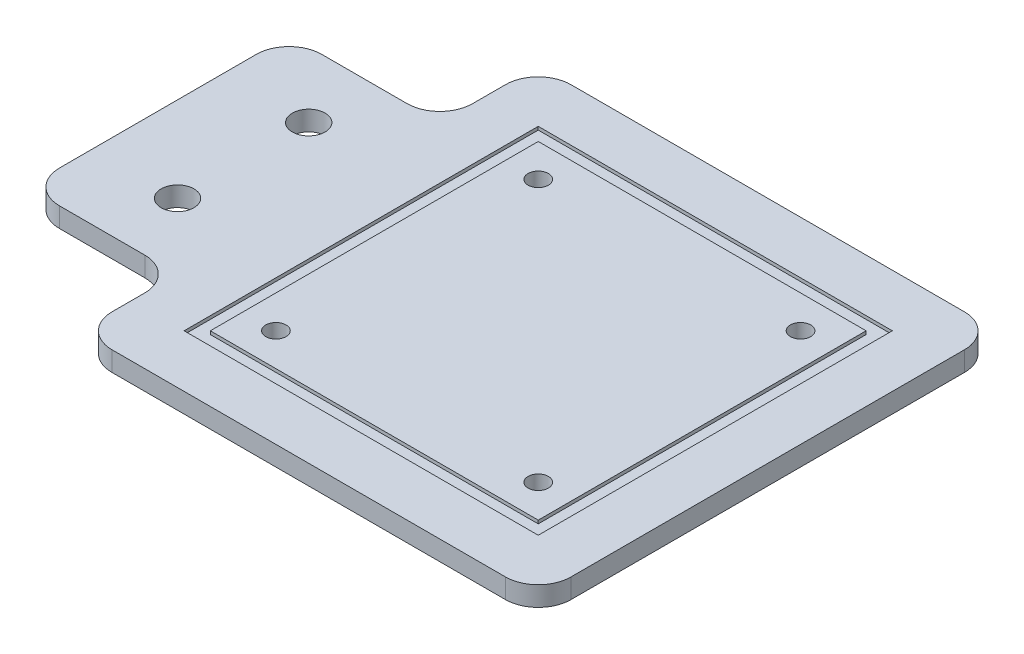
ISO-10303-21;
HEADER;
FILE_DESCRIPTION(('STEP AP214'),'2;1');
FILE_NAME('part.step','',(''),(''),'','','');
FILE_SCHEMA(('AUTOMOTIVE_DESIGN { 1 0 10303 214 1 1 1 1 }'));
ENDSEC;
DATA;
#1=APPLICATION_CONTEXT('core data for automotive mechanical design processes');
#2=APPLICATION_PROTOCOL_DEFINITION('international standard','automotive_design',2000,#1);
#3=PRODUCT_CONTEXT('',#1,'mechanical');
#4=PRODUCT('Part','Part','',(#3));
#5=PRODUCT_RELATED_PRODUCT_CATEGORY('part','',(#4));
#6=PRODUCT_DEFINITION_FORMATION('','',#4);
#7=PRODUCT_DEFINITION_CONTEXT('part definition',#1,'design');
#8=PRODUCT_DEFINITION('design','',#6,#7);
#9=PRODUCT_DEFINITION_SHAPE('','',#8);
#10=(LENGTH_UNIT() NAMED_UNIT(*) SI_UNIT(.MILLI.,.METRE.));
#11=(NAMED_UNIT(*) PLANE_ANGLE_UNIT() SI_UNIT($,.RADIAN.));
#12=(NAMED_UNIT(*) SI_UNIT($,.STERADIAN.) SOLID_ANGLE_UNIT());
#13=UNCERTAINTY_MEASURE_WITH_UNIT(LENGTH_MEASURE(1.E-05),#10,'distance_accuracy_value','');
#14=(GEOMETRIC_REPRESENTATION_CONTEXT(3) GLOBAL_UNCERTAINTY_ASSIGNED_CONTEXT((#13)) GLOBAL_UNIT_ASSIGNED_CONTEXT((#10,
#11,#12)) REPRESENTATION_CONTEXT('',''));
#15=CARTESIAN_POINT('',(0.,0.,0.));
#16=DIRECTION('',(0.,0.,1.));
#17=DIRECTION('',(1.,0.,0.));
#18=AXIS2_PLACEMENT_3D('',#15,#16,#17);
#19=CARTESIAN_POINT('',(23.,20.,40.));
#20=DIRECTION('',(0.,1.,0.));
#21=DIRECTION('',(-1.,0.,0.));
#22=AXIS2_PLACEMENT_3D('',#19,#20,#21);
#23=PLANE('',#22);
#24=CARTESIAN_POINT('',(78.,20.,40.));
#25=DIRECTION('',(0.,1.,0.));
#26=DIRECTION('',(-1.,0.,0.));
#27=AXIS2_PLACEMENT_3D('',#24,#25,#26);
#28=CIRCLE('',#27,1.54999999999999);
#29=CARTESIAN_POINT('',(76.45,20.,40.));
#30=VERTEX_POINT('',#29);
#31=EDGE_CURVE('E503',#30,#30,#28,.F.);
#32=ORIENTED_EDGE('',*,*,#31,.F.);
#33=EDGE_LOOP('',(#32));
#34=FACE_BOUND('',#33,.T.);
#35=CARTESIAN_POINT('',(78.,20.,0.));
#36=DIRECTION('',(0.,1.,0.));
#37=DIRECTION('',(-1.,0.,0.));
#38=AXIS2_PLACEMENT_3D('',#35,#36,#37);
#39=CIRCLE('',#38,1.54999999999999);
#40=CARTESIAN_POINT('',(76.45,20.,0.));
#41=VERTEX_POINT('',#40);
#42=EDGE_CURVE('E520',#41,#41,#39,.F.);
#43=ORIENTED_EDGE('',*,*,#42,.F.);
#44=EDGE_LOOP('',(#43));
#45=FACE_BOUND('',#44,.T.);
#46=CARTESIAN_POINT('',(38.,20.,0.));
#47=DIRECTION('',(0.,1.,0.));
#48=DIRECTION('',(-1.,0.,0.));
#49=AXIS2_PLACEMENT_3D('',#46,#47,#48);
#50=CIRCLE('',#49,1.55);
#51=CARTESIAN_POINT('',(36.45,20.,0.));
#52=VERTEX_POINT('',#51);
#53=EDGE_CURVE('E510',#52,#52,#50,.F.);
#54=ORIENTED_EDGE('',*,*,#53,.F.);
#55=EDGE_LOOP('',(#54));
#56=FACE_BOUND('',#55,.T.);
#57=CARTESIAN_POINT('',(38.,20.,40.));
#58=DIRECTION('',(0.,1.,0.));
#59=DIRECTION('',(-1.,0.,0.));
#60=AXIS2_PLACEMENT_3D('',#57,#58,#59);
#61=CIRCLE('',#60,1.55);
#62=CARTESIAN_POINT('',(36.45,20.,40.));
#63=VERTEX_POINT('',#62);
#64=EDGE_CURVE('E242',#63,#63,#61,.F.);
#65=ORIENTED_EDGE('',*,*,#64,.F.);
#66=EDGE_LOOP('',(#65));
#67=FACE_BOUND('',#66,.T.);
#68=CARTESIAN_POINT('',(13.,20.,10.));
#69=DIRECTION('',(0.,1.,0.));
#70=DIRECTION('',(-1.,0.,0.));
#71=AXIS2_PLACEMENT_3D('',#68,#69,#70);
#72=CIRCLE('',#71,2.5);
#73=CARTESIAN_POINT('',(10.5,20.,10.));
#74=VERTEX_POINT('',#73);
#75=EDGE_CURVE('E347',#74,#74,#72,.F.);
#76=ORIENTED_EDGE('',*,*,#75,.F.);
#77=EDGE_LOOP('',(#76));
#78=FACE_BOUND('',#77,.T.);
#79=CARTESIAN_POINT('',(13.,20.,30.));
#80=DIRECTION('',(0.,1.,0.));
#81=DIRECTION('',(-1.,0.,0.));
#82=AXIS2_PLACEMENT_3D('',#79,#80,#81);
#83=CIRCLE('',#82,2.5);
#84=CARTESIAN_POINT('',(10.5,20.,30.));
#85=VERTEX_POINT('',#84);
#86=EDGE_CURVE('E342',#85,#85,#83,.F.);
#87=ORIENTED_EDGE('',*,*,#86,.F.);
#88=EDGE_LOOP('',(#87));
#89=FACE_BOUND('',#88,.T.);
#90=DIRECTION('',(0.,0.,1.));
#91=VECTOR('',#90,1.);
#92=CARTESIAN_POINT('',(93.,20.,55.));
#93=LINE('',#92,#91);
#94=CARTESIAN_POINT('',(93.,20.,-10.));
#95=VERTEX_POINT('',#94);
#96=CARTESIAN_POINT('',(93.,20.,50.));
#97=VERTEX_POINT('',#96);
#98=EDGE_CURVE('E309',#95,#97,#93,.T.);
#99=ORIENTED_EDGE('',*,*,#98,.T.);
#100=CARTESIAN_POINT('',(88.,20.,50.));
#101=DIRECTION('',(0.,1.,0.));
#102=DIRECTION('',(-1.,0.,0.));
#103=AXIS2_PLACEMENT_3D('',#100,#101,#102);
#104=CIRCLE('',#103,5.);
#105=CARTESIAN_POINT('',(88.,20.,55.));
#106=VERTEX_POINT('',#105);
#107=EDGE_CURVE('E423',#97,#106,#104,.F.);
#108=ORIENTED_EDGE('',*,*,#107,.T.);
#109=DIRECTION('',(-1.,0.,0.));
#110=VECTOR('',#109,1.);
#111=CARTESIAN_POINT('',(93.,20.,55.));
#112=LINE('',#111,#110);
#113=CARTESIAN_POINT('',(28.,20.,55.));
#114=VERTEX_POINT('',#113);
#115=EDGE_CURVE('E323',#106,#114,#112,.T.);
#116=ORIENTED_EDGE('',*,*,#115,.T.);
#117=CARTESIAN_POINT('',(28.,20.,50.));
#118=DIRECTION('',(0.,1.,0.));
#119=DIRECTION('',(-1.,0.,0.));
#120=AXIS2_PLACEMENT_3D('',#117,#118,#119);
#121=CIRCLE('',#120,5.);
#122=CARTESIAN_POINT('',(23.,20.,50.));
#123=VERTEX_POINT('',#122);
#124=EDGE_CURVE('E414',#114,#123,#121,.F.);
#125=ORIENTED_EDGE('',*,*,#124,.T.);
#126=DIRECTION('',(0.,0.,-1.));
#127=VECTOR('',#126,1.);
#128=CARTESIAN_POINT('',(23.,20.,55.));
#129=LINE('',#128,#127);
#130=CARTESIAN_POINT('',(23.,20.,45.));
#131=VERTEX_POINT('',#130);
#132=EDGE_CURVE('E319',#123,#131,#129,.T.);
#133=ORIENTED_EDGE('',*,*,#132,.T.);
#134=CARTESIAN_POINT('',(18.,20.,45.));
#135=DIRECTION('',(0.,1.,0.));
#136=DIRECTION('',(-1.,0.,0.));
#137=AXIS2_PLACEMENT_3D('',#134,#135,#136);
#138=CIRCLE('',#137,5.);
#139=CARTESIAN_POINT('',(18.,20.,40.));
#140=VERTEX_POINT('',#139);
#141=EDGE_CURVE('E11',#131,#140,#138,.T.);
#142=ORIENTED_EDGE('',*,*,#141,.T.);
#143=DIRECTION('',(1.,0.,0.));
#144=VECTOR('',#143,1.);
#145=CARTESIAN_POINT('',(23.,20.,40.));
#146=LINE('',#145,#144);
#147=CARTESIAN_POINT('',(5.,20.,40.));
#148=VERTEX_POINT('',#147);
#149=EDGE_CURVE('E359',#148,#140,#146,.T.);
#150=ORIENTED_EDGE('',*,*,#149,.F.);
#151=CARTESIAN_POINT('',(5.,20.,35.));
#152=DIRECTION('',(0.,1.,0.));
#153=DIRECTION('',(-1.,0.,0.));
#154=AXIS2_PLACEMENT_3D('',#151,#152,#153);
#155=CIRCLE('',#154,5.);
#156=CARTESIAN_POINT('',(0.,20.,35.));
#157=VERTEX_POINT('',#156);
#158=EDGE_CURVE('E66',#148,#157,#155,.F.);
#159=ORIENTED_EDGE('',*,*,#158,.T.);
#160=DIRECTION('',(0.,0.,-1.));
#161=VECTOR('',#160,1.);
#162=CARTESIAN_POINT('',(0.,20.,0.));
#163=LINE('',#162,#161);
#164=CARTESIAN_POINT('',(0.,20.,5.));
#165=VERTEX_POINT('',#164);
#166=EDGE_CURVE('E498',#157,#165,#163,.T.);
#167=ORIENTED_EDGE('',*,*,#166,.T.);
#168=CARTESIAN_POINT('',(5.,20.,5.));
#169=DIRECTION('',(0.,1.,0.));
#170=DIRECTION('',(-1.,0.,0.));
#171=AXIS2_PLACEMENT_3D('',#168,#169,#170);
#172=CIRCLE('',#171,5.);
#173=CARTESIAN_POINT('',(5.,20.,0.));
#174=VERTEX_POINT('',#173);
#175=EDGE_CURVE('E58',#165,#174,#172,.F.);
#176=ORIENTED_EDGE('',*,*,#175,.T.);
#177=DIRECTION('',(1.,0.,0.));
#178=VECTOR('',#177,1.);
#179=CARTESIAN_POINT('',(23.,20.,0.));
#180=LINE('',#179,#178);
#181=CARTESIAN_POINT('',(18.,20.,0.));
#182=VERTEX_POINT('',#181);
#183=EDGE_CURVE('E352',#174,#182,#180,.T.);
#184=ORIENTED_EDGE('',*,*,#183,.T.);
#185=CARTESIAN_POINT('',(18.,20.,-5.));
#186=DIRECTION('',(0.,1.,0.));
#187=DIRECTION('',(-1.,0.,0.));
#188=AXIS2_PLACEMENT_3D('',#185,#186,#187);
#189=CIRCLE('',#188,5.);
#190=CARTESIAN_POINT('',(23.,20.,-5.));
#191=VERTEX_POINT('',#190);
#192=EDGE_CURVE('E470',#182,#191,#189,.T.);
#193=ORIENTED_EDGE('',*,*,#192,.T.);
#194=CARTESIAN_POINT('',(23.,20.,-10.));
#195=VERTEX_POINT('',#194);
#196=EDGE_CURVE('E318',#191,#195,#129,.T.);
#197=ORIENTED_EDGE('',*,*,#196,.T.);
#198=CARTESIAN_POINT('',(28.,20.,-10.));
#199=DIRECTION('',(0.,1.,0.));
#200=DIRECTION('',(-1.,0.,0.));
#201=AXIS2_PLACEMENT_3D('',#198,#199,#200);
#202=CIRCLE('',#201,5.);
#203=CARTESIAN_POINT('',(28.,20.,-15.));
#204=VERTEX_POINT('',#203);
#205=EDGE_CURVE('E417',#195,#204,#202,.F.);
#206=ORIENTED_EDGE('',*,*,#205,.T.);
#207=DIRECTION('',(1.,0.,0.));
#208=VECTOR('',#207,1.);
#209=CARTESIAN_POINT('',(93.,20.,-15.));
#210=LINE('',#209,#208);
#211=CARTESIAN_POINT('',(88.,20.,-15.));
#212=VERTEX_POINT('',#211);
#213=EDGE_CURVE('E313',#204,#212,#210,.T.);
#214=ORIENTED_EDGE('',*,*,#213,.T.);
#215=CARTESIAN_POINT('',(88.,20.,-10.));
#216=DIRECTION('',(0.,1.,0.));
#217=DIRECTION('',(-1.,0.,0.));
#218=AXIS2_PLACEMENT_3D('',#215,#216,#217);
#219=CIRCLE('',#218,5.);
#220=EDGE_CURVE('E420',#212,#95,#219,.F.);
#221=ORIENTED_EDGE('',*,*,#220,.T.);
#222=EDGE_LOOP('',(#99,#108,#116,#125,#133,#142,#150,#159,#167,#176,#184,#193,#197,#206,#214,#221));
#223=FACE_BOUND('',#222,.T.);
#224=ADVANCED_FACE('F42',(#34,#45,#56,#67,#78,#89,#223),#23,.F.);
#225=CARTESIAN_POINT('',(0.,23.,40.));
#226=DIRECTION('',(0.,-1.,0.));
#227=DIRECTION('',(0.,0.,-1.));
#228=AXIS2_PLACEMENT_3D('',#225,#226,#227);
#229=PLANE('',#228);
#230=DIRECTION('',(1.,0.,0.));
#231=VECTOR('',#230,1.);
#232=CARTESIAN_POINT('',(31.,23.,47.));
#233=LINE('',#232,#231);
#234=CARTESIAN_POINT('',(31.,23.,47.));
#235=VERTEX_POINT('',#234);
#236=CARTESIAN_POINT('',(85.,23.,47.));
#237=VERTEX_POINT('',#236);
#238=EDGE_CURVE('E285',#235,#237,#233,.T.);
#239=ORIENTED_EDGE('',*,*,#238,.F.);
#240=DIRECTION('',(0.,0.,1.));
#241=VECTOR('',#240,1.);
#242=CARTESIAN_POINT('',(31.,23.,47.));
#243=LINE('',#242,#241);
#244=CARTESIAN_POINT('',(31.,23.,-6.99999999999999));
#245=VERTEX_POINT('',#244);
#246=EDGE_CURVE('E259',#245,#235,#243,.T.);
#247=ORIENTED_EDGE('',*,*,#246,.F.);
#248=DIRECTION('',(-1.,0.,0.));
#249=VECTOR('',#248,1.);
#250=CARTESIAN_POINT('',(31.,23.,-6.99999999999999));
#251=LINE('',#250,#249);
#252=CARTESIAN_POINT('',(85.,23.,-6.99999999999999));
#253=VERTEX_POINT('',#252);
#254=EDGE_CURVE('E270',#253,#245,#251,.T.);
#255=ORIENTED_EDGE('',*,*,#254,.F.);
#256=DIRECTION('',(0.,0.,-1.));
#257=VECTOR('',#256,1.);
#258=CARTESIAN_POINT('',(85.,23.,47.));
#259=LINE('',#258,#257);
#260=EDGE_CURVE('E289',#237,#253,#259,.T.);
#261=ORIENTED_EDGE('',*,*,#260,.F.);
#262=EDGE_LOOP('',(#239,#247,#255,#261));
#263=FACE_BOUND('',#262,.T.);
#264=CARTESIAN_POINT('',(13.,23.,10.));
#265=DIRECTION('',(0.,1.,0.));
#266=DIRECTION('',(0.,0.,1.));
#267=AXIS2_PLACEMENT_3D('',#264,#265,#266);
#268=CIRCLE('',#267,2.5);
#269=CARTESIAN_POINT('',(13.,23.,12.5));
#270=VERTEX_POINT('',#269);
#271=EDGE_CURVE('E343',#270,#270,#268,.T.);
#272=ORIENTED_EDGE('',*,*,#271,.F.);
#273=EDGE_LOOP('',(#272));
#274=FACE_BOUND('',#273,.T.);
#275=CARTESIAN_POINT('',(13.,23.,30.));
#276=DIRECTION('',(0.,1.,0.));
#277=DIRECTION('',(0.,0.,1.));
#278=AXIS2_PLACEMENT_3D('',#275,#276,#277);
#279=CIRCLE('',#278,2.5);
#280=CARTESIAN_POINT('',(13.,23.,32.5));
#281=VERTEX_POINT('',#280);
#282=EDGE_CURVE('E348',#281,#281,#279,.T.);
#283=ORIENTED_EDGE('',*,*,#282,.F.);
#284=EDGE_LOOP('',(#283));
#285=FACE_BOUND('',#284,.T.);
#286=DIRECTION('',(1.,0.,0.));
#287=VECTOR('',#286,1.);
#288=CARTESIAN_POINT('',(93.,23.,55.));
#289=LINE('',#288,#287);
#290=CARTESIAN_POINT('',(28.,23.,55.));
#291=VERTEX_POINT('',#290);
#292=CARTESIAN_POINT('',(88.,23.,55.));
#293=VERTEX_POINT('',#292);
#294=EDGE_CURVE('E328',#291,#293,#289,.T.);
#295=ORIENTED_EDGE('',*,*,#294,.T.);
#296=CARTESIAN_POINT('',(88.,23.,50.));
#297=DIRECTION('',(0.,-1.,0.));
#298=DIRECTION('',(0.,0.,-1.));
#299=AXIS2_PLACEMENT_3D('',#296,#297,#298);
#300=CIRCLE('',#299,5.);
#301=CARTESIAN_POINT('',(93.,23.,50.));
#302=VERTEX_POINT('',#301);
#303=EDGE_CURVE('E400',#293,#302,#300,.F.);
#304=ORIENTED_EDGE('',*,*,#303,.T.);
#305=DIRECTION('',(0.,0.,-1.));
#306=VECTOR('',#305,1.);
#307=CARTESIAN_POINT('',(93.,23.,55.));
#308=LINE('',#307,#306);
#309=CARTESIAN_POINT('',(93.,23.,-10.));
#310=VERTEX_POINT('',#309);
#311=EDGE_CURVE('E332',#302,#310,#308,.T.);
#312=ORIENTED_EDGE('',*,*,#311,.T.);
#313=CARTESIAN_POINT('',(88.,23.,-10.));
#314=DIRECTION('',(0.,-1.,0.));
#315=DIRECTION('',(0.,0.,-1.));
#316=AXIS2_PLACEMENT_3D('',#313,#314,#315);
#317=CIRCLE('',#316,5.);
#318=CARTESIAN_POINT('',(88.,23.,-15.));
#319=VERTEX_POINT('',#318);
#320=EDGE_CURVE('E397',#310,#319,#317,.F.);
#321=ORIENTED_EDGE('',*,*,#320,.T.);
#322=DIRECTION('',(-1.,0.,0.));
#323=VECTOR('',#322,1.);
#324=CARTESIAN_POINT('',(93.,23.,-15.));
#325=LINE('',#324,#323);
#326=CARTESIAN_POINT('',(28.,23.,-15.));
#327=VERTEX_POINT('',#326);
#328=EDGE_CURVE('E314',#319,#327,#325,.T.);
#329=ORIENTED_EDGE('',*,*,#328,.T.);
#330=CARTESIAN_POINT('',(28.,23.,-10.));
#331=DIRECTION('',(0.,-1.,0.));
#332=DIRECTION('',(0.,0.,-1.));
#333=AXIS2_PLACEMENT_3D('',#330,#331,#332);
#334=CIRCLE('',#333,5.);
#335=CARTESIAN_POINT('',(23.,23.,-10.));
#336=VERTEX_POINT('',#335);
#337=EDGE_CURVE('E394',#327,#336,#334,.F.);
#338=ORIENTED_EDGE('',*,*,#337,.T.);
#339=DIRECTION('',(0.,0.,1.));
#340=VECTOR('',#339,1.);
#341=CARTESIAN_POINT('',(23.,23.,55.));
#342=LINE('',#341,#340);
#343=CARTESIAN_POINT('',(23.,23.,-5.));
#344=VERTEX_POINT('',#343);
#345=EDGE_CURVE('E324',#336,#344,#342,.T.);
#346=ORIENTED_EDGE('',*,*,#345,.T.);
#347=CARTESIAN_POINT('',(18.,23.,-5.));
#348=DIRECTION('',(0.,-1.,0.));
#349=DIRECTION('',(0.,0.,-1.));
#350=AXIS2_PLACEMENT_3D('',#347,#348,#349);
#351=CIRCLE('',#350,5.);
#352=CARTESIAN_POINT('',(18.,23.,0.));
#353=VERTEX_POINT('',#352);
#354=EDGE_CURVE('E467',#344,#353,#351,.T.);
#355=ORIENTED_EDGE('',*,*,#354,.T.);
#356=DIRECTION('',(-1.,0.,0.));
#357=VECTOR('',#356,1.);
#358=CARTESIAN_POINT('',(0.,23.,0.));
#359=LINE('',#358,#357);
#360=CARTESIAN_POINT('',(5.,23.,0.));
#361=VERTEX_POINT('',#360);
#362=EDGE_CURVE('E364',#353,#361,#359,.T.);
#363=ORIENTED_EDGE('',*,*,#362,.T.);
#364=CARTESIAN_POINT('',(5.,23.,5.));
#365=DIRECTION('',(0.,-1.,0.));
#366=DIRECTION('',(0.,0.,-1.));
#367=AXIS2_PLACEMENT_3D('',#364,#365,#366);
#368=CIRCLE('',#367,5.);
#369=CARTESIAN_POINT('',(0.,23.,5.));
#370=VERTEX_POINT('',#369);
#371=EDGE_CURVE('E385',#361,#370,#368,.F.);
#372=ORIENTED_EDGE('',*,*,#371,.T.);
#373=DIRECTION('',(0.,0.,-1.));
#374=VECTOR('',#373,1.);
#375=CARTESIAN_POINT('',(0.,23.,40.));
#376=LINE('',#375,#374);
#377=CARTESIAN_POINT('',(0.,23.,35.));
#378=VERTEX_POINT('',#377);
#379=EDGE_CURVE('E368',#378,#370,#376,.T.);
#380=ORIENTED_EDGE('',*,*,#379,.F.);
#381=CARTESIAN_POINT('',(5.,23.,35.));
#382=DIRECTION('',(0.,-1.,0.));
#383=DIRECTION('',(0.,0.,-1.));
#384=AXIS2_PLACEMENT_3D('',#381,#382,#383);
#385=CIRCLE('',#384,5.);
#386=CARTESIAN_POINT('',(5.,23.,40.));
#387=VERTEX_POINT('',#386);
#388=EDGE_CURVE('E388',#378,#387,#385,.F.);
#389=ORIENTED_EDGE('',*,*,#388,.T.);
#390=DIRECTION('',(-1.,0.,0.));
#391=VECTOR('',#390,1.);
#392=CARTESIAN_POINT('',(0.,23.,40.));
#393=LINE('',#392,#391);
#394=CARTESIAN_POINT('',(18.,23.,40.));
#395=VERTEX_POINT('',#394);
#396=EDGE_CURVE('E363',#395,#387,#393,.T.);
#397=ORIENTED_EDGE('',*,*,#396,.F.);
#398=CARTESIAN_POINT('',(18.,23.,45.));
#399=DIRECTION('',(0.,-1.,0.));
#400=DIRECTION('',(0.,0.,-1.));
#401=AXIS2_PLACEMENT_3D('',#398,#399,#400);
#402=CIRCLE('',#401,5.);
#403=CARTESIAN_POINT('',(23.,23.,45.));
#404=VERTEX_POINT('',#403);
#405=EDGE_CURVE('E51',#395,#404,#402,.T.);
#406=ORIENTED_EDGE('',*,*,#405,.T.);
#407=CARTESIAN_POINT('',(23.,23.,50.));
#408=VERTEX_POINT('',#407);
#409=EDGE_CURVE('E299',#404,#408,#342,.T.);
#410=ORIENTED_EDGE('',*,*,#409,.T.);
#411=CARTESIAN_POINT('',(28.,23.,50.));
#412=DIRECTION('',(0.,-1.,0.));
#413=DIRECTION('',(0.,0.,-1.));
#414=AXIS2_PLACEMENT_3D('',#411,#412,#413);
#415=CIRCLE('',#414,5.);
#416=EDGE_CURVE('E391',#408,#291,#415,.F.);
#417=ORIENTED_EDGE('',*,*,#416,.T.);
#418=EDGE_LOOP('',(#295,#304,#312,#321,#329,#338,#346,#355,#363,#372,#380,#389,#397,#406,#410,#417));
#419=FACE_BOUND('',#418,.T.);
#420=ADVANCED_FACE('F477',(#263,#274,#285,#419),#229,.F.);
#421=CARTESIAN_POINT('',(0.,0.,40.));
#422=DIRECTION('',(1.,0.,0.));
#423=DIRECTION('',(0.,0.,-1.));
#424=AXIS2_PLACEMENT_3D('',#421,#422,#423);
#425=PLANE('',#424);
#426=ORIENTED_EDGE('',*,*,#166,.F.);
#427=DIRECTION('',(0.,-1.,0.));
#428=VECTOR('',#427,1.);
#429=CARTESIAN_POINT('',(0.,0.,35.));
#430=LINE('',#429,#428);
#431=EDGE_CURVE('E464',#157,#378,#430,.F.);
#432=ORIENTED_EDGE('',*,*,#431,.T.);
#433=ORIENTED_EDGE('',*,*,#379,.T.);
#434=DIRECTION('',(0.,-1.,0.));
#435=VECTOR('',#434,1.);
#436=CARTESIAN_POINT('',(0.,20.,5.));
#437=LINE('',#436,#435);
#438=EDGE_CURVE('E461',#370,#165,#437,.T.);
#439=ORIENTED_EDGE('',*,*,#438,.T.);
#440=EDGE_LOOP('',(#426,#432,#433,#439));
#441=FACE_BOUND('',#440,.T.);
#442=ADVANCED_FACE('F497',(#441),#425,.F.);
#443=CARTESIAN_POINT('',(0.,0.,40.));
#444=DIRECTION('',(0.,0.,-1.));
#445=DIRECTION('',(-1.,0.,0.));
#446=AXIS2_PLACEMENT_3D('',#443,#444,#445);
#447=PLANE('',#446);
#448=ORIENTED_EDGE('',*,*,#149,.T.);
#449=DIRECTION('',(0.,1.,0.));
#450=VECTOR('',#449,1.);
#451=CARTESIAN_POINT('',(18.,0.,40.));
#452=LINE('',#451,#450);
#453=EDGE_CURVE('E450',#140,#395,#452,.T.);
#454=ORIENTED_EDGE('',*,*,#453,.T.);
#455=ORIENTED_EDGE('',*,*,#396,.T.);
#456=DIRECTION('',(0.,-1.,0.));
#457=VECTOR('',#456,1.);
#458=CARTESIAN_POINT('',(5.,0.,40.));
#459=LINE('',#458,#457);
#460=EDGE_CURVE('E446',#387,#148,#459,.T.);
#461=ORIENTED_EDGE('',*,*,#460,.T.);
#462=EDGE_LOOP('',(#448,#454,#455,#461));
#463=FACE_BOUND('',#462,.T.);
#464=ADVANCED_FACE('F489',(#463),#447,.F.);
#465=CARTESIAN_POINT('',(0.,0.,0.));
#466=DIRECTION('',(0.,0.,-1.));
#467=DIRECTION('',(-1.,0.,0.));
#468=AXIS2_PLACEMENT_3D('',#465,#466,#467);
#469=PLANE('',#468);
#470=ORIENTED_EDGE('',*,*,#362,.F.);
#471=DIRECTION('',(0.,1.,0.));
#472=VECTOR('',#471,1.);
#473=CARTESIAN_POINT('',(18.,20.,0.));
#474=LINE('',#473,#472);
#475=EDGE_CURVE('E443',#353,#182,#474,.F.);
#476=ORIENTED_EDGE('',*,*,#475,.T.);
#477=ORIENTED_EDGE('',*,*,#183,.F.);
#478=DIRECTION('',(0.,-1.,0.));
#479=VECTOR('',#478,1.);
#480=CARTESIAN_POINT('',(5.,23.,0.));
#481=LINE('',#480,#479);
#482=EDGE_CURVE('E440',#174,#361,#481,.F.);
#483=ORIENTED_EDGE('',*,*,#482,.T.);
#484=EDGE_LOOP('',(#470,#476,#477,#483));
#485=FACE_BOUND('',#484,.T.);
#486=ADVANCED_FACE('F550',(#485),#469,.T.);
#487=CARTESIAN_POINT('',(13.,-0.001000000000001,30.));
#488=DIRECTION('',(0.,1.,0.));
#489=DIRECTION('',(0.,0.,1.));
#490=AXIS2_PLACEMENT_3D('',#487,#488,#489);
#491=CYLINDRICAL_SURFACE('',#490,2.5);
#492=ORIENTED_EDGE('',*,*,#282,.T.);
#493=EDGE_LOOP('',(#492));
#494=FACE_BOUND('',#493,.T.);
#495=ORIENTED_EDGE('',*,*,#86,.T.);
#496=EDGE_LOOP('',(#495));
#497=FACE_BOUND('',#496,.T.);
#498=ADVANCED_FACE('F547',(#494,#497),#491,.F.);
#499=CARTESIAN_POINT('',(13.,-0.001000000000001,10.));
#500=DIRECTION('',(0.,1.,0.));
#501=DIRECTION('',(0.,0.,1.));
#502=AXIS2_PLACEMENT_3D('',#499,#500,#501);
#503=CYLINDRICAL_SURFACE('',#502,2.5);
#504=ORIENTED_EDGE('',*,*,#271,.T.);
#505=EDGE_LOOP('',(#504));
#506=FACE_BOUND('',#505,.T.);
#507=ORIENTED_EDGE('',*,*,#75,.T.);
#508=EDGE_LOOP('',(#507));
#509=FACE_BOUND('',#508,.T.);
#510=ADVANCED_FACE('F549',(#506,#509),#503,.F.);
#511=CARTESIAN_POINT('',(23.,-78.9949493661166,55.));
#512=DIRECTION('',(-1.,0.,0.));
#513=DIRECTION('',(0.,0.,1.));
#514=AXIS2_PLACEMENT_3D('',#511,#512,#513);
#515=PLANE('',#514);
#516=ORIENTED_EDGE('',*,*,#409,.F.);
#517=DIRECTION('',(0.,1.,0.));
#518=VECTOR('',#517,1.);
#519=CARTESIAN_POINT('',(23.,-78.9949493661166,45.));
#520=LINE('',#519,#518);
#521=EDGE_CURVE('E458',#404,#131,#520,.F.);
#522=ORIENTED_EDGE('',*,*,#521,.T.);
#523=ORIENTED_EDGE('',*,*,#132,.F.);
#524=DIRECTION('',(0.,1.,0.));
#525=VECTOR('',#524,1.);
#526=CARTESIAN_POINT('',(23.,-78.9949493661166,50.));
#527=LINE('',#526,#525);
#528=EDGE_CURVE('E454',#123,#408,#527,.T.);
#529=ORIENTED_EDGE('',*,*,#528,.T.);
#530=EDGE_LOOP('',(#516,#522,#523,#529));
#531=FACE_BOUND('',#530,.T.);
#532=ADVANCED_FACE('F482',(#531),#515,.T.);
#533=ORIENTED_EDGE('',*,*,#345,.F.);
#534=DIRECTION('',(0.,1.,0.));
#535=VECTOR('',#534,1.);
#536=CARTESIAN_POINT('',(23.,-78.9949493661166,-10.));
#537=LINE('',#536,#535);
#538=EDGE_CURVE('E437',#336,#195,#537,.F.);
#539=ORIENTED_EDGE('',*,*,#538,.T.);
#540=ORIENTED_EDGE('',*,*,#196,.F.);
#541=DIRECTION('',(0.,1.,0.));
#542=VECTOR('',#541,1.);
#543=CARTESIAN_POINT('',(23.,23.,-5.));
#544=LINE('',#543,#542);
#545=EDGE_CURVE('E433',#191,#344,#544,.T.);
#546=ORIENTED_EDGE('',*,*,#545,.T.);
#547=EDGE_LOOP('',(#533,#539,#540,#546));
#548=FACE_BOUND('',#547,.T.);
#549=ADVANCED_FACE('F684',(#548),#515,.T.);
#550=CARTESIAN_POINT('',(93.,-78.9949493661166,-15.));
#551=DIRECTION('',(0.,0.,-1.));
#552=DIRECTION('',(-1.,0.,0.));
#553=AXIS2_PLACEMENT_3D('',#550,#551,#552);
#554=PLANE('',#553);
#555=ORIENTED_EDGE('',*,*,#328,.F.);
#556=DIRECTION('',(0.,1.,0.));
#557=VECTOR('',#556,1.);
#558=CARTESIAN_POINT('',(88.,-78.9949493661166,-15.));
#559=LINE('',#558,#557);
#560=EDGE_CURVE('E430',#319,#212,#559,.F.);
#561=ORIENTED_EDGE('',*,*,#560,.T.);
#562=ORIENTED_EDGE('',*,*,#213,.F.);
#563=DIRECTION('',(0.,1.,0.));
#564=VECTOR('',#563,1.);
#565=CARTESIAN_POINT('',(28.,-78.9949493661166,-15.));
#566=LINE('',#565,#564);
#567=EDGE_CURVE('E426',#204,#327,#566,.T.);
#568=ORIENTED_EDGE('',*,*,#567,.T.);
#569=EDGE_LOOP('',(#555,#561,#562,#568));
#570=FACE_BOUND('',#569,.T.);
#571=ADVANCED_FACE('F673',(#570),#554,.T.);
#572=CARTESIAN_POINT('',(93.,-78.9949493661166,55.));
#573=DIRECTION('',(1.,0.,0.));
#574=DIRECTION('',(0.,0.,-1.));
#575=AXIS2_PLACEMENT_3D('',#572,#573,#574);
#576=PLANE('',#575);
#577=ORIENTED_EDGE('',*,*,#311,.F.);
#578=DIRECTION('',(0.,1.,0.));
#579=VECTOR('',#578,1.);
#580=CARTESIAN_POINT('',(93.,-78.9949493661166,50.));
#581=LINE('',#580,#579);
#582=EDGE_CURVE('E407',#302,#97,#581,.F.);
#583=ORIENTED_EDGE('',*,*,#582,.T.);
#584=ORIENTED_EDGE('',*,*,#98,.F.);
#585=DIRECTION('',(0.,1.,0.));
#586=VECTOR('',#585,1.);
#587=CARTESIAN_POINT('',(93.,-78.9949493661166,-10.));
#588=LINE('',#587,#586);
#589=EDGE_CURVE('E403',#95,#310,#588,.T.);
#590=ORIENTED_EDGE('',*,*,#589,.T.);
#591=EDGE_LOOP('',(#577,#583,#584,#590));
#592=FACE_BOUND('',#591,.T.);
#593=ADVANCED_FACE('F660',(#592),#576,.T.);
#594=CARTESIAN_POINT('',(93.,-78.9949493661166,55.));
#595=DIRECTION('',(0.,0.,1.));
#596=DIRECTION('',(1.,0.,0.));
#597=AXIS2_PLACEMENT_3D('',#594,#595,#596);
#598=PLANE('',#597);
#599=ORIENTED_EDGE('',*,*,#115,.F.);
#600=DIRECTION('',(0.,1.,0.));
#601=VECTOR('',#600,1.);
#602=CARTESIAN_POINT('',(88.,-78.9949493661166,55.));
#603=LINE('',#602,#601);
#604=EDGE_CURVE('E381',#106,#293,#603,.T.);
#605=ORIENTED_EDGE('',*,*,#604,.T.);
#606=ORIENTED_EDGE('',*,*,#294,.F.);
#607=DIRECTION('',(0.,1.,0.));
#608=VECTOR('',#607,1.);
#609=CARTESIAN_POINT('',(28.,-78.9949493661166,55.));
#610=LINE('',#609,#608);
#611=EDGE_CURVE('E378',#291,#114,#610,.F.);
#612=ORIENTED_EDGE('',*,*,#611,.T.);
#613=EDGE_LOOP('',(#599,#605,#606,#612));
#614=FACE_BOUND('',#613,.T.);
#615=ADVANCED_FACE('F654',(#614),#598,.T.);
#616=CARTESIAN_POINT('',(31.,22.5,47.));
#617=DIRECTION('',(-1.,0.,0.));
#618=DIRECTION('',(0.,0.,1.));
#619=AXIS2_PLACEMENT_3D('',#616,#617,#618);
#620=PLANE('',#619);
#621=ORIENTED_EDGE('',*,*,#246,.T.);
#622=DIRECTION('',(0.,1.,0.));
#623=VECTOR('',#622,1.);
#624=CARTESIAN_POINT('',(31.,22.5,47.));
#625=LINE('',#624,#623);
#626=CARTESIAN_POINT('',(31.,22.5,47.));
#627=VERTEX_POINT('',#626);
#628=EDGE_CURVE('E282',#627,#235,#625,.T.);
#629=ORIENTED_EDGE('',*,*,#628,.F.);
#630=DIRECTION('',(0.,0.,1.));
#631=VECTOR('',#630,1.);
#632=CARTESIAN_POINT('',(31.,22.5,47.));
#633=LINE('',#632,#631);
#634=CARTESIAN_POINT('',(31.,22.5,-6.99999999999999));
#635=VERTEX_POINT('',#634);
#636=EDGE_CURVE('E265',#635,#627,#633,.T.);
#637=ORIENTED_EDGE('',*,*,#636,.F.);
#638=DIRECTION('',(0.,1.,0.));
#639=VECTOR('',#638,1.);
#640=CARTESIAN_POINT('',(31.,22.5,-6.99999999999999));
#641=LINE('',#640,#639);
#642=EDGE_CURVE('E296',#635,#245,#641,.T.);
#643=ORIENTED_EDGE('',*,*,#642,.T.);
#644=EDGE_LOOP('',(#621,#629,#637,#643));
#645=FACE_BOUND('',#644,.T.);
#646=ADVANCED_FACE('F659',(#645),#620,.F.);
#647=CARTESIAN_POINT('',(31.,22.5,-6.99999999999999));
#648=DIRECTION('',(0.,0.,-1.));
#649=DIRECTION('',(-1.,0.,0.));
#650=AXIS2_PLACEMENT_3D('',#647,#648,#649);
#651=PLANE('',#650);
#652=ORIENTED_EDGE('',*,*,#254,.T.);
#653=ORIENTED_EDGE('',*,*,#642,.F.);
#654=DIRECTION('',(-1.,0.,0.));
#655=VECTOR('',#654,1.);
#656=CARTESIAN_POINT('',(31.,22.5,-6.99999999999999));
#657=LINE('',#656,#655);
#658=CARTESIAN_POINT('',(85.,22.5,-6.99999999999999));
#659=VERTEX_POINT('',#658);
#660=EDGE_CURVE('E278',#659,#635,#657,.T.);
#661=ORIENTED_EDGE('',*,*,#660,.F.);
#662=DIRECTION('',(0.,1.,0.));
#663=VECTOR('',#662,1.);
#664=CARTESIAN_POINT('',(85.,22.5,-6.99999999999999));
#665=LINE('',#664,#663);
#666=EDGE_CURVE('E300',#659,#253,#665,.T.);
#667=ORIENTED_EDGE('',*,*,#666,.T.);
#668=EDGE_LOOP('',(#652,#653,#661,#667));
#669=FACE_BOUND('',#668,.T.);
#670=ADVANCED_FACE('F857',(#669),#651,.F.);
#671=CARTESIAN_POINT('',(85.,22.5,47.));
#672=DIRECTION('',(1.,0.,0.));
#673=DIRECTION('',(0.,0.,-1.));
#674=AXIS2_PLACEMENT_3D('',#671,#672,#673);
#675=PLANE('',#674);
#676=ORIENTED_EDGE('',*,*,#260,.T.);
#677=ORIENTED_EDGE('',*,*,#666,.F.);
#678=DIRECTION('',(0.,0.,-1.));
#679=VECTOR('',#678,1.);
#680=CARTESIAN_POINT('',(85.,22.5,47.));
#681=LINE('',#680,#679);
#682=CARTESIAN_POINT('',(85.,22.5,47.));
#683=VERTEX_POINT('',#682);
#684=EDGE_CURVE('E274',#683,#659,#681,.T.);
#685=ORIENTED_EDGE('',*,*,#684,.F.);
#686=DIRECTION('',(0.,1.,0.));
#687=VECTOR('',#686,1.);
#688=CARTESIAN_POINT('',(85.,22.5,47.));
#689=LINE('',#688,#687);
#690=EDGE_CURVE('E303',#683,#237,#689,.T.);
#691=ORIENTED_EDGE('',*,*,#690,.T.);
#692=EDGE_LOOP('',(#676,#677,#685,#691));
#693=FACE_BOUND('',#692,.T.);
#694=ADVANCED_FACE('F846',(#693),#675,.F.);
#695=CARTESIAN_POINT('',(31.,22.5,47.));
#696=DIRECTION('',(0.,0.,1.));
#697=DIRECTION('',(1.,0.,0.));
#698=AXIS2_PLACEMENT_3D('',#695,#696,#697);
#699=PLANE('',#698);
#700=ORIENTED_EDGE('',*,*,#238,.T.);
#701=ORIENTED_EDGE('',*,*,#690,.F.);
#702=DIRECTION('',(1.,0.,0.));
#703=VECTOR('',#702,1.);
#704=CARTESIAN_POINT('',(31.,22.5,47.));
#705=LINE('',#704,#703);
#706=EDGE_CURVE('E269',#627,#683,#705,.T.);
#707=ORIENTED_EDGE('',*,*,#706,.F.);
#708=ORIENTED_EDGE('',*,*,#628,.T.);
#709=EDGE_LOOP('',(#700,#701,#707,#708));
#710=FACE_BOUND('',#709,.T.);
#711=ADVANCED_FACE('F836',(#710),#699,.F.);
#712=CARTESIAN_POINT('',(0.,22.5,0.));
#713=DIRECTION('',(0.,-1.,0.));
#714=DIRECTION('',(0.,0.,-1.));
#715=AXIS2_PLACEMENT_3D('',#712,#713,#714);
#716=PLANE('',#715);
#717=DIRECTION('',(0.,0.,-1.));
#718=VECTOR('',#717,1.);
#719=CARTESIAN_POINT('',(83.,22.5,45.));
#720=LINE('',#719,#718);
#721=CARTESIAN_POINT('',(83.,22.5,45.));
#722=VERTEX_POINT('',#721);
#723=CARTESIAN_POINT('',(83.,22.5,-4.99999999999999));
#724=VERTEX_POINT('',#723);
#725=EDGE_CURVE('E225',#722,#724,#720,.T.);
#726=ORIENTED_EDGE('',*,*,#725,.F.);
#727=DIRECTION('',(1.,0.,0.));
#728=VECTOR('',#727,1.);
#729=CARTESIAN_POINT('',(33.,22.5,45.));
#730=LINE('',#729,#728);
#731=CARTESIAN_POINT('',(33.,22.5,45.));
#732=VERTEX_POINT('',#731);
#733=EDGE_CURVE('E218',#732,#722,#730,.T.);
#734=ORIENTED_EDGE('',*,*,#733,.F.);
#735=DIRECTION('',(0.,0.,1.));
#736=VECTOR('',#735,1.);
#737=CARTESIAN_POINT('',(33.,22.5,45.));
#738=LINE('',#737,#736);
#739=CARTESIAN_POINT('',(33.,22.5,-4.99999999999999));
#740=VERTEX_POINT('',#739);
#741=EDGE_CURVE('E228',#740,#732,#738,.T.);
#742=ORIENTED_EDGE('',*,*,#741,.F.);
#743=DIRECTION('',(-1.,0.,0.));
#744=VECTOR('',#743,1.);
#745=CARTESIAN_POINT('',(33.,22.5,-4.99999999999999));
#746=LINE('',#745,#744);
#747=EDGE_CURVE('E209',#724,#740,#746,.T.);
#748=ORIENTED_EDGE('',*,*,#747,.F.);
#749=EDGE_LOOP('',(#726,#734,#742,#748));
#750=FACE_BOUND('',#749,.T.);
#751=ORIENTED_EDGE('',*,*,#636,.T.);
#752=ORIENTED_EDGE('',*,*,#706,.T.);
#753=ORIENTED_EDGE('',*,*,#684,.T.);
#754=ORIENTED_EDGE('',*,*,#660,.T.);
#755=EDGE_LOOP('',(#751,#752,#753,#754));
#756=FACE_BOUND('',#755,.T.);
#757=ADVANCED_FACE('F222',(#750,#756),#716,.F.);
#758=CARTESIAN_POINT('',(83.,22.5,45.));
#759=DIRECTION('',(1.,0.,0.));
#760=DIRECTION('',(0.,0.,-1.));
#761=AXIS2_PLACEMENT_3D('',#758,#759,#760);
#762=PLANE('',#761);
#763=DIRECTION('',(0.,0.,-1.));
#764=VECTOR('',#763,1.);
#765=CARTESIAN_POINT('',(83.,23.,45.));
#766=LINE('',#765,#764);
#767=CARTESIAN_POINT('',(83.,23.,45.));
#768=VERTEX_POINT('',#767);
#769=CARTESIAN_POINT('',(83.,23.,-4.99999999999999));
#770=VERTEX_POINT('',#769);
#771=EDGE_CURVE('E249',#768,#770,#766,.T.);
#772=ORIENTED_EDGE('',*,*,#771,.F.);
#773=DIRECTION('',(0.,1.,0.));
#774=VECTOR('',#773,1.);
#775=CARTESIAN_POINT('',(83.,22.5,45.));
#776=LINE('',#775,#774);
#777=EDGE_CURVE('E233',#722,#768,#776,.T.);
#778=ORIENTED_EDGE('',*,*,#777,.F.);
#779=ORIENTED_EDGE('',*,*,#725,.T.);
#780=DIRECTION('',(0.,1.,0.));
#781=VECTOR('',#780,1.);
#782=CARTESIAN_POINT('',(83.,22.5,-4.99999999999999));
#783=LINE('',#782,#781);
#784=EDGE_CURVE('E205',#724,#770,#783,.T.);
#785=ORIENTED_EDGE('',*,*,#784,.T.);
#786=EDGE_LOOP('',(#772,#778,#779,#785));
#787=FACE_BOUND('',#786,.T.);
#788=ADVANCED_FACE('F232',(#787),#762,.T.);
#789=CARTESIAN_POINT('',(33.,22.5,45.));
#790=DIRECTION('',(0.,0.,1.));
#791=DIRECTION('',(1.,0.,0.));
#792=AXIS2_PLACEMENT_3D('',#789,#790,#791);
#793=PLANE('',#792);
#794=DIRECTION('',(1.,0.,0.));
#795=VECTOR('',#794,1.);
#796=CARTESIAN_POINT('',(33.,23.,45.));
#797=LINE('',#796,#795);
#798=CARTESIAN_POINT('',(33.,23.,45.));
#799=VERTEX_POINT('',#798);
#800=EDGE_CURVE('E235',#799,#768,#797,.T.);
#801=ORIENTED_EDGE('',*,*,#800,.F.);
#802=DIRECTION('',(0.,1.,0.));
#803=VECTOR('',#802,1.);
#804=CARTESIAN_POINT('',(33.,22.5,45.));
#805=LINE('',#804,#803);
#806=EDGE_CURVE('E260',#732,#799,#805,.T.);
#807=ORIENTED_EDGE('',*,*,#806,.F.);
#808=ORIENTED_EDGE('',*,*,#733,.T.);
#809=ORIENTED_EDGE('',*,*,#777,.T.);
#810=EDGE_LOOP('',(#801,#807,#808,#809));
#811=FACE_BOUND('',#810,.T.);
#812=ADVANCED_FACE('F806',(#811),#793,.T.);
#813=CARTESIAN_POINT('',(33.,22.5,45.));
#814=DIRECTION('',(-1.,0.,0.));
#815=DIRECTION('',(0.,0.,1.));
#816=AXIS2_PLACEMENT_3D('',#813,#814,#815);
#817=PLANE('',#816);
#818=DIRECTION('',(0.,0.,1.));
#819=VECTOR('',#818,1.);
#820=CARTESIAN_POINT('',(33.,23.,45.));
#821=LINE('',#820,#819);
#822=CARTESIAN_POINT('',(33.,23.,-4.99999999999998));
#823=VERTEX_POINT('',#822);
#824=EDGE_CURVE('E239',#823,#799,#821,.T.);
#825=ORIENTED_EDGE('',*,*,#824,.F.);
#826=DIRECTION('',(0.,1.,0.));
#827=VECTOR('',#826,1.);
#828=CARTESIAN_POINT('',(33.,22.5,-4.99999999999999));
#829=LINE('',#828,#827);
#830=EDGE_CURVE('E217',#740,#823,#829,.T.);
#831=ORIENTED_EDGE('',*,*,#830,.F.);
#832=ORIENTED_EDGE('',*,*,#741,.T.);
#833=ORIENTED_EDGE('',*,*,#806,.T.);
#834=EDGE_LOOP('',(#825,#831,#832,#833));
#835=FACE_BOUND('',#834,.T.);
#836=ADVANCED_FACE('F796',(#835),#817,.T.);
#837=CARTESIAN_POINT('',(33.,22.5,-4.99999999999999));
#838=DIRECTION('',(0.,0.,-1.));
#839=DIRECTION('',(-1.,0.,0.));
#840=AXIS2_PLACEMENT_3D('',#837,#838,#839);
#841=PLANE('',#840);
#842=DIRECTION('',(-1.,0.,0.));
#843=VECTOR('',#842,1.);
#844=CARTESIAN_POINT('',(33.,23.,-4.99999999999999));
#845=LINE('',#844,#843);
#846=EDGE_CURVE('E211',#770,#823,#845,.T.);
#847=ORIENTED_EDGE('',*,*,#846,.F.);
#848=ORIENTED_EDGE('',*,*,#784,.F.);
#849=ORIENTED_EDGE('',*,*,#747,.T.);
#850=ORIENTED_EDGE('',*,*,#830,.T.);
#851=EDGE_LOOP('',(#847,#848,#849,#850));
#852=FACE_BOUND('',#851,.T.);
#853=ADVANCED_FACE('F207',(#852),#841,.T.);
#854=CARTESIAN_POINT('',(78.,23.,40.));
#855=DIRECTION('',(0.,1.,0.));
#856=DIRECTION('',(0.,0.,1.));
#857=AXIS2_PLACEMENT_3D('',#854,#855,#856);
#858=CIRCLE('',#857,1.54999999999999);
#859=CARTESIAN_POINT('',(78.,23.,41.55));
#860=VERTEX_POINT('',#859);
#861=EDGE_CURVE('E507',#860,#860,#858,.T.);
#862=ORIENTED_EDGE('',*,*,#861,.F.);
#863=EDGE_LOOP('',(#862));
#864=FACE_BOUND('',#863,.T.);
#865=CARTESIAN_POINT('',(78.,23.,0.));
#866=DIRECTION('',(0.,1.,0.));
#867=DIRECTION('',(0.,0.,1.));
#868=AXIS2_PLACEMENT_3D('',#865,#866,#867);
#869=CIRCLE('',#868,1.54999999999999);
#870=CARTESIAN_POINT('',(78.,23.,1.55000000000001));
#871=VERTEX_POINT('',#870);
#872=EDGE_CURVE('E515',#871,#871,#869,.T.);
#873=ORIENTED_EDGE('',*,*,#872,.F.);
#874=EDGE_LOOP('',(#873));
#875=FACE_BOUND('',#874,.T.);
#876=CARTESIAN_POINT('',(38.,23.,0.));
#877=DIRECTION('',(0.,1.,0.));
#878=DIRECTION('',(0.,0.,1.));
#879=AXIS2_PLACEMENT_3D('',#876,#877,#878);
#880=CIRCLE('',#879,1.55);
#881=CARTESIAN_POINT('',(38.,23.,1.55000000000002));
#882=VERTEX_POINT('',#881);
#883=EDGE_CURVE('E514',#882,#882,#880,.T.);
#884=ORIENTED_EDGE('',*,*,#883,.F.);
#885=EDGE_LOOP('',(#884));
#886=FACE_BOUND('',#885,.T.);
#887=CARTESIAN_POINT('',(38.,23.,40.));
#888=DIRECTION('',(0.,1.,0.));
#889=DIRECTION('',(0.,0.,1.));
#890=AXIS2_PLACEMENT_3D('',#887,#888,#889);
#891=CIRCLE('',#890,1.55);
#892=CARTESIAN_POINT('',(38.,23.,41.55));
#893=VERTEX_POINT('',#892);
#894=EDGE_CURVE('E519',#893,#893,#891,.T.);
#895=ORIENTED_EDGE('',*,*,#894,.F.);
#896=EDGE_LOOP('',(#895));
#897=FACE_BOUND('',#896,.T.);
#898=ORIENTED_EDGE('',*,*,#771,.T.);
#899=ORIENTED_EDGE('',*,*,#846,.T.);
#900=ORIENTED_EDGE('',*,*,#824,.T.);
#901=ORIENTED_EDGE('',*,*,#800,.T.);
#902=EDGE_LOOP('',(#898,#899,#900,#901));
#903=FACE_BOUND('',#902,.T.);
#904=ADVANCED_FACE('F569',(#864,#875,#886,#897,#903),#229,.F.);
#905=CARTESIAN_POINT('',(38.,-0.001000000000001,40.));
#906=DIRECTION('',(0.,1.,0.));
#907=DIRECTION('',(0.,0.,1.));
#908=AXIS2_PLACEMENT_3D('',#905,#906,#907);
#909=CYLINDRICAL_SURFACE('',#908,1.55);
#910=ORIENTED_EDGE('',*,*,#894,.T.);
#911=EDGE_LOOP('',(#910));
#912=FACE_BOUND('',#911,.T.);
#913=ORIENTED_EDGE('',*,*,#64,.T.);
#914=EDGE_LOOP('',(#913));
#915=FACE_BOUND('',#914,.T.);
#916=ADVANCED_FACE('F537',(#912,#915),#909,.F.);
#917=CARTESIAN_POINT('',(38.,-0.001000000000001,0.));
#918=DIRECTION('',(0.,1.,0.));
#919=DIRECTION('',(0.,0.,1.));
#920=AXIS2_PLACEMENT_3D('',#917,#918,#919);
#921=CYLINDRICAL_SURFACE('',#920,1.55);
#922=ORIENTED_EDGE('',*,*,#883,.T.);
#923=EDGE_LOOP('',(#922));
#924=FACE_BOUND('',#923,.T.);
#925=ORIENTED_EDGE('',*,*,#53,.T.);
#926=EDGE_LOOP('',(#925));
#927=FACE_BOUND('',#926,.T.);
#928=ADVANCED_FACE('F757',(#924,#927),#921,.F.);
#929=CARTESIAN_POINT('',(78.,-0.001000000000001,0.));
#930=DIRECTION('',(0.,1.,0.));
#931=DIRECTION('',(0.,0.,1.));
#932=AXIS2_PLACEMENT_3D('',#929,#930,#931);
#933=CYLINDRICAL_SURFACE('',#932,1.54999999999999);
#934=ORIENTED_EDGE('',*,*,#872,.T.);
#935=EDGE_LOOP('',(#934));
#936=FACE_BOUND('',#935,.T.);
#937=ORIENTED_EDGE('',*,*,#42,.T.);
#938=EDGE_LOOP('',(#937));
#939=FACE_BOUND('',#938,.T.);
#940=ADVANCED_FACE('F746',(#936,#939),#933,.F.);
#941=CARTESIAN_POINT('',(78.,-0.001000000000001,40.));
#942=DIRECTION('',(0.,1.,0.));
#943=DIRECTION('',(0.,0.,1.));
#944=AXIS2_PLACEMENT_3D('',#941,#942,#943);
#945=CYLINDRICAL_SURFACE('',#944,1.54999999999999);
#946=ORIENTED_EDGE('',*,*,#861,.T.);
#947=EDGE_LOOP('',(#946));
#948=FACE_BOUND('',#947,.T.);
#949=ORIENTED_EDGE('',*,*,#31,.T.);
#950=EDGE_LOOP('',(#949));
#951=FACE_BOUND('',#950,.T.);
#952=ADVANCED_FACE('F575',(#948,#951),#945,.F.);
#953=CARTESIAN_POINT('',(88.,-78.9949493661166,50.));
#954=DIRECTION('',(0.,1.,0.));
#955=DIRECTION('',(0.,0.,1.));
#956=AXIS2_PLACEMENT_3D('',#953,#954,#955);
#957=CYLINDRICAL_SURFACE('',#956,5.);
#958=ORIENTED_EDGE('',*,*,#107,.F.);
#959=ORIENTED_EDGE('',*,*,#582,.F.);
#960=ORIENTED_EDGE('',*,*,#303,.F.);
#961=ORIENTED_EDGE('',*,*,#604,.F.);
#962=EDGE_LOOP('',(#958,#959,#960,#961));
#963=FACE_BOUND('',#962,.T.);
#964=ADVANCED_FACE('F571',(#963),#957,.T.);
#965=CARTESIAN_POINT('',(88.,-78.9949493661166,-10.));
#966=DIRECTION('',(0.,1.,0.));
#967=DIRECTION('',(0.,0.,1.));
#968=AXIS2_PLACEMENT_3D('',#965,#966,#967);
#969=CYLINDRICAL_SURFACE('',#968,5.);
#970=ORIENTED_EDGE('',*,*,#220,.F.);
#971=ORIENTED_EDGE('',*,*,#560,.F.);
#972=ORIENTED_EDGE('',*,*,#320,.F.);
#973=ORIENTED_EDGE('',*,*,#589,.F.);
#974=EDGE_LOOP('',(#970,#971,#972,#973));
#975=FACE_BOUND('',#974,.T.);
#976=ADVANCED_FACE('F574',(#975),#969,.T.);
#977=CARTESIAN_POINT('',(28.,-78.9949493661166,-10.));
#978=DIRECTION('',(0.,1.,0.));
#979=DIRECTION('',(0.,0.,1.));
#980=AXIS2_PLACEMENT_3D('',#977,#978,#979);
#981=CYLINDRICAL_SURFACE('',#980,5.);
#982=ORIENTED_EDGE('',*,*,#205,.F.);
#983=ORIENTED_EDGE('',*,*,#538,.F.);
#984=ORIENTED_EDGE('',*,*,#337,.F.);
#985=ORIENTED_EDGE('',*,*,#567,.F.);
#986=EDGE_LOOP('',(#982,#983,#984,#985));
#987=FACE_BOUND('',#986,.T.);
#988=ADVANCED_FACE('F579',(#987),#981,.T.);
#989=CARTESIAN_POINT('',(18.,-78.9949493661166,-5.));
#990=DIRECTION('',(0.,-1.,0.));
#991=DIRECTION('',(0.,0.,-1.));
#992=AXIS2_PLACEMENT_3D('',#989,#990,#991);
#993=CYLINDRICAL_SURFACE('',#992,5.);
#994=ORIENTED_EDGE('',*,*,#192,.F.);
#995=ORIENTED_EDGE('',*,*,#475,.F.);
#996=ORIENTED_EDGE('',*,*,#354,.F.);
#997=ORIENTED_EDGE('',*,*,#545,.F.);
#998=EDGE_LOOP('',(#994,#995,#996,#997));
#999=FACE_BOUND('',#998,.T.);
#1000=ADVANCED_FACE('F583',(#999),#993,.F.);
#1001=CARTESIAN_POINT('',(18.,0.,45.));
#1002=DIRECTION('',(0.,1.,0.));
#1003=DIRECTION('',(0.,0.,1.));
#1004=AXIS2_PLACEMENT_3D('',#1001,#1002,#1003);
#1005=CYLINDRICAL_SURFACE('',#1004,5.);
#1006=ORIENTED_EDGE('',*,*,#141,.F.);
#1007=ORIENTED_EDGE('',*,*,#521,.F.);
#1008=ORIENTED_EDGE('',*,*,#405,.F.);
#1009=ORIENTED_EDGE('',*,*,#453,.F.);
#1010=EDGE_LOOP('',(#1006,#1007,#1008,#1009));
#1011=FACE_BOUND('',#1010,.T.);
#1012=ADVANCED_FACE('F487',(#1011),#1005,.F.);
#1013=CARTESIAN_POINT('',(28.,-78.9949493661166,50.));
#1014=DIRECTION('',(0.,1.,0.));
#1015=DIRECTION('',(0.,0.,1.));
#1016=AXIS2_PLACEMENT_3D('',#1013,#1014,#1015);
#1017=CYLINDRICAL_SURFACE('',#1016,5.);
#1018=ORIENTED_EDGE('',*,*,#124,.F.);
#1019=ORIENTED_EDGE('',*,*,#611,.F.);
#1020=ORIENTED_EDGE('',*,*,#416,.F.);
#1021=ORIENTED_EDGE('',*,*,#528,.F.);
#1022=EDGE_LOOP('',(#1018,#1019,#1020,#1021));
#1023=FACE_BOUND('',#1022,.T.);
#1024=ADVANCED_FACE('F590',(#1023),#1017,.T.);
#1025=CARTESIAN_POINT('',(5.,0.,35.));
#1026=DIRECTION('',(0.,-1.,0.));
#1027=DIRECTION('',(0.,0.,-1.));
#1028=AXIS2_PLACEMENT_3D('',#1025,#1026,#1027);
#1029=CYLINDRICAL_SURFACE('',#1028,5.);
#1030=ORIENTED_EDGE('',*,*,#388,.F.);
#1031=ORIENTED_EDGE('',*,*,#431,.F.);
#1032=ORIENTED_EDGE('',*,*,#158,.F.);
#1033=ORIENTED_EDGE('',*,*,#460,.F.);
#1034=EDGE_LOOP('',(#1030,#1031,#1032,#1033));
#1035=FACE_BOUND('',#1034,.T.);
#1036=ADVANCED_FACE('F493',(#1035),#1029,.T.);
#1037=CARTESIAN_POINT('',(5.,0.,5.));
#1038=DIRECTION('',(0.,1.,0.));
#1039=DIRECTION('',(0.,0.,1.));
#1040=AXIS2_PLACEMENT_3D('',#1037,#1038,#1039);
#1041=CYLINDRICAL_SURFACE('',#1040,5.);
#1042=ORIENTED_EDGE('',*,*,#371,.F.);
#1043=ORIENTED_EDGE('',*,*,#482,.F.);
#1044=ORIENTED_EDGE('',*,*,#175,.F.);
#1045=ORIENTED_EDGE('',*,*,#438,.F.);
#1046=EDGE_LOOP('',(#1042,#1043,#1044,#1045));
#1047=FACE_BOUND('',#1046,.T.);
#1048=ADVANCED_FACE('F44',(#1047),#1041,.T.);
#1049=CLOSED_SHELL('',(#224,#420,#442,#464,#486,#498,#510,#532,#549,#571,#593,#615,#646,#670,
#694,#711,#757,#788,#812,#836,#853,#904,#916,#928,#940,#952,#964,#976,#988,#1000,#1012,#1024,
#1036,#1048));
#1050=MANIFOLD_SOLID_BREP('B2',#1049);
#1051=ADVANCED_BREP_SHAPE_REPRESENTATION('',(#18,#1050),#14);
#1052=SHAPE_DEFINITION_REPRESENTATION(#9,#1051);
ENDSEC;
END-ISO-10303-21;
